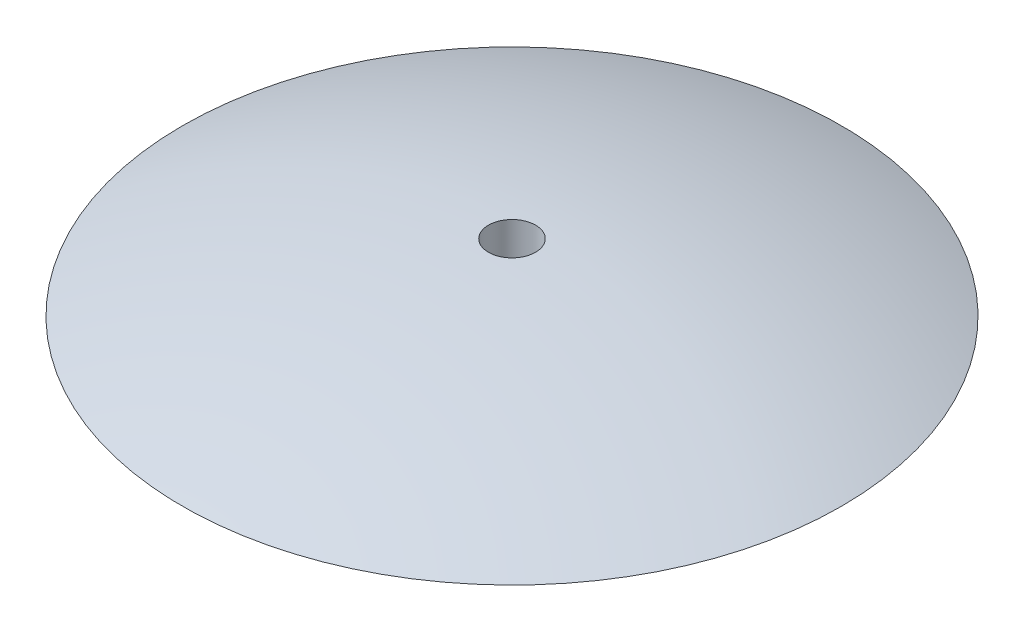
ISO-10303-21;
HEADER;
FILE_DESCRIPTION(('STEP AP214'),'2;1');
FILE_NAME('part.step','',(''),(''),'','','');
FILE_SCHEMA(('AUTOMOTIVE_DESIGN { 1 0 10303 214 1 1 1 1 }'));
ENDSEC;
DATA;
#1=APPLICATION_CONTEXT('core data for automotive mechanical design processes');
#2=APPLICATION_PROTOCOL_DEFINITION('international standard','automotive_design',2000,#1);
#3=PRODUCT_CONTEXT('',#1,'mechanical');
#4=PRODUCT('Part','Part','',(#3));
#5=PRODUCT_RELATED_PRODUCT_CATEGORY('part','',(#4));
#6=PRODUCT_DEFINITION_FORMATION('','',#4);
#7=PRODUCT_DEFINITION_CONTEXT('part definition',#1,'design');
#8=PRODUCT_DEFINITION('design','',#6,#7);
#9=PRODUCT_DEFINITION_SHAPE('','',#8);
#10=(LENGTH_UNIT() NAMED_UNIT(*) SI_UNIT(.MILLI.,.METRE.));
#11=(NAMED_UNIT(*) PLANE_ANGLE_UNIT() SI_UNIT($,.RADIAN.));
#12=(NAMED_UNIT(*) SI_UNIT($,.STERADIAN.) SOLID_ANGLE_UNIT());
#13=UNCERTAINTY_MEASURE_WITH_UNIT(LENGTH_MEASURE(1.E-05),#10,'distance_accuracy_value','');
#14=(GEOMETRIC_REPRESENTATION_CONTEXT(3) GLOBAL_UNCERTAINTY_ASSIGNED_CONTEXT((#13)) GLOBAL_UNIT_ASSIGNED_CONTEXT((#10,
#11,#12)) REPRESENTATION_CONTEXT('',''));
#15=CARTESIAN_POINT('',(0.,0.,0.));
#16=DIRECTION('',(0.,0.,1.));
#17=DIRECTION('',(1.,0.,0.));
#18=AXIS2_PLACEMENT_3D('',#15,#16,#17);
#19=CARTESIAN_POINT('',(0.,0.,0.));
#20=DIRECTION('',(0.,1.,0.));
#21=DIRECTION('',(1.,0.,0.));
#22=AXIS2_PLACEMENT_3D('',#19,#20,#21);
#23=SPHERICAL_SURFACE('',#22,125.);
#24=CARTESIAN_POINT('',(0.,124.950990392233,0.));
#25=DIRECTION('',(0.,-1.,0.));
#26=DIRECTION('',(0.,0.,-1.));
#27=AXIS2_PLACEMENT_3D('',#24,#25,#26);
#28=CIRCLE('',#27,3.5);
#29=CARTESIAN_POINT('',(3.49999999999989,124.950990392233,0.));
#30=VERTEX_POINT('',#29);
#31=EDGE_CURVE('E37',#30,#30,#28,.T.);
#32=CARTESIAN_POINT('',(0.,115.,0.));
#33=DIRECTION('',(0.,1.,0.));
#34=DIRECTION('',(0.,0.,1.));
#35=AXIS2_PLACEMENT_3D('',#32,#33,#34);
#36=CIRCLE('',#35,48.9897948556635);
#37=CARTESIAN_POINT('',(48.9897948556636,115.,0.));
#38=VERTEX_POINT('',#37);
#39=EDGE_CURVE('E10',#38,#38,#36,.T.);
#40=CARTESIAN_POINT('',(3.49999999999989,124.950990392233,0.));
#41=CARTESIAN_POINT('',(3.9877151951773,124.937329151167,0.));
#42=CARTESIAN_POINT('',(4.47535039404707,124.92081212117,0.));
#43=CARTESIAN_POINT('',(5.4503939607175,124.882069365421,0.));
#44=CARTESIAN_POINT('',(5.93780232851816,124.859843639667,0.));
#45=CARTESIAN_POINT('',(6.91232539459649,124.809686374509,0.));
#46=CARTESIAN_POINT('',(7.39944009287416,124.781754835103,0.));
#47=CARTESIAN_POINT('',(8.37330903005358,124.720189816847,0.));
#48=CARTESIAN_POINT('',(8.86006326895532,124.686556337997,0.));
#49=CARTESIAN_POINT('',(9.83314454472187,124.613592040689,0.));
#50=CARTESIAN_POINT('',(10.3194715815867,124.574261222232,0.));
#51=CARTESIAN_POINT('',(11.2916317697933,124.48990764181,0.));
#52=CARTESIAN_POINT('',(11.7774649211352,124.444884879845,0.));
#53=CARTESIAN_POINT('',(12.7485707223695,124.349153584933,0.));
#54=CARTESIAN_POINT('',(13.233843372262,124.298445051985,0.));
#55=CARTESIAN_POINT('',(14.2037616315684,124.191349168328,0.));
#56=CARTESIAN_POINT('',(14.6884072409824,124.134961817619,0.));
#57=CARTESIAN_POINT('',(15.6570049662687,124.01651603003,0.));
#58=CARTESIAN_POINT('',(16.140957082141,123.954457593151,0.));
#59=CARTESIAN_POINT('',(17.108101462374,123.824678142495,0.));
#60=CARTESIAN_POINT('',(17.5912937267346,123.756957128717,0.));
#61=CARTESIAN_POINT('',(18.5568521501613,123.61586180995,0.));
#62=CARTESIAN_POINT('',(19.0392183092274,123.54248750496,0.));
#63=CARTESIAN_POINT('',(20.0030583815557,123.390095664618,0.));
#64=CARTESIAN_POINT('',(20.4845322948178,123.311078129266,0.));
#65=CARTESIAN_POINT('',(21.4465218573705,123.147410662835,0.));
#66=CARTESIAN_POINT('',(21.927037506661,123.062760731754,0.));
#67=CARTESIAN_POINT('',(22.8870446544968,122.887840080793,0.));
#68=CARTESIAN_POINT('',(23.3665361530421,122.797569360912,0.));
#69=CARTESIAN_POINT('',(24.3244292530422,122.611419509984,0.));
#70=CARTESIAN_POINT('',(24.802830854497,122.515540378936,0.));
#71=CARTESIAN_POINT('',(25.758478563414,122.318186852314,0.));
#72=CARTESIAN_POINT('',(26.2357246708762,122.21671245674,0.));
#73=CARTESIAN_POINT('',(27.1889959533438,122.008182314911,0.));
#74=CARTESIAN_POINT('',(27.665021128349,121.901126568656,0.));
#75=CARTESIAN_POINT('',(28.6157852748485,121.681448404608,0.));
#76=CARTESIAN_POINT('',(29.0905242463428,121.568825986815,0.));
#77=CARTESIAN_POINT('',(30.0386508911263,121.338029922117,0.));
#78=CARTESIAN_POINT('',(30.5120385644156,121.219856275212,0.));
#79=CARTESIAN_POINT('',(31.457397703381,120.977973955885,0.));
#80=CARTESIAN_POINT('',(31.9293691690571,120.854265283463,0.));
#81=CARTESIAN_POINT('',(32.8718311775738,120.601329875639,0.));
#82=CARTESIAN_POINT('',(33.3423217204143,120.472103140237,0.));
#83=CARTESIAN_POINT('',(34.2817573710971,120.208149325613,0.));
#84=CARTESIAN_POINT('',(34.7507024789393,120.07342224639,0.));
#85=CARTESIAN_POINT('',(35.6869829593671,119.79848621747,0.));
#86=CARTESIAN_POINT('',(36.1543183319526,119.658277267772,0.));
#87=CARTESIAN_POINT('',(37.0873152623327,119.372396722911,0.));
#88=CARTESIAN_POINT('',(37.5529768201273,119.226725127747,0.));
#89=CARTESIAN_POINT('',(38.4825622708912,118.929939265963,0.));
#90=CARTESIAN_POINT('',(38.9464861638606,118.778824999342,0.));
#91=CARTESIAN_POINT('',(39.8725326732327,118.471174515006,0.));
#92=CARTESIAN_POINT('',(40.3346552896354,118.314638297291,0.));
#93=CARTESIAN_POINT('',(41.2570358810075,117.996165374303,0.));
#94=CARTESIAN_POINT('',(41.7172938559768,117.834228669029,0.));
#95=CARTESIAN_POINT('',(42.6358820557015,117.504976975958,0.));
#96=CARTESIAN_POINT('',(43.0942122804569,117.337661988159,0.));
#97=CARTESIAN_POINT('',(44.0088821337609,116.997676668791,0.));
#98=CARTESIAN_POINT('',(44.4652217623096,116.825006337222,0.));
#99=CARTESIAN_POINT('',(45.3758478558956,116.474334017304,0.));
#100=CARTESIAN_POINT('',(45.8301343209328,116.296332028957,0.));
#101=CARTESIAN_POINT('',(46.7365917802786,115.935020761538,0.));
#102=CARTESIAN_POINT('',(47.1887627745871,115.751711482468,0.));
#103=CARTESIAN_POINT('',(48.0909273553237,115.37981092144,0.));
#104=CARTESIAN_POINT('',(48.5409209417518,115.191219639483,0.));
#105=CARTESIAN_POINT('',(48.9897948556636,115.,0.));
#106=B_SPLINE_CURVE_WITH_KNOTS('',3,(#40,#41,#42,#43,#44,#45,#46,#47,#48,#49,#50,#51,#52,#53,
#54,#55,#56,#57,#58,#59,#60,#61,#62,#63,#64,#65,#66,#67,#68,#69,#70,#71,#72,#73,#74,#75,#76,#77,
#78,#79,#80,#81,#82,#83,#84,#85,#86,#87,#88,#89,#90,#91,#92,#93,#94,#95,#96,#97,#98,#99,#100,
#101,#102,#103,#104,#105),.UNSPECIFIED.,.F.,.F.,(4,2,2,2,2,2,2,2,2,2,2,2,2,2,2,2,2,2,2,2,2,2,2,
2,2,2,2,2,2,2,2,2,4),(0.,1.46371109685941,2.92742219371885,4.39113329057826,5.85484438743769,
7.3185554842971,8.78226658115654,10.245977678016,11.7096887748754,13.1733998717348,
14.6371109685942,16.1008220654536,17.5645331623131,19.0282442591725,20.4919553560319,
21.9556664528913,23.4193775497507,24.8830886466102,26.3467997434696,27.810510840329,
29.2742219371884,30.7379330340479,32.2016441309073,33.6653552277667,35.1290663246261,
36.5927774214856,38.056488518345,39.5201996152044,40.9839107120638,42.4476218089232,
43.9113329057827,45.3750440026421,46.8387550995015),.UNSPECIFIED.);
#107=EDGE_CURVE('BSEAM31',#30,#38,#106,.T.);
#108=ORIENTED_EDGE('',*,*,#31,.T.);
#109=ORIENTED_EDGE('',*,*,#39,.T.);
#110=ORIENTED_EDGE('',*,*,#107,.T.);
#111=ORIENTED_EDGE('',*,*,#107,.F.);
#112=EDGE_LOOP('',(#108,#110,#109,#111));
#113=FACE_BOUND('',#112,.T.);
#114=ADVANCED_FACE('F31',(#113),#23,.T.);
#115=CARTESIAN_POINT('',(48.9897948556635,115.,0.));
#116=DIRECTION('',(0.,1.,0.));
#117=DIRECTION('',(0.,0.,1.));
#118=AXIS2_PLACEMENT_3D('',#115,#116,#117);
#119=PLANE('',#118);
#120=CARTESIAN_POINT('',(0.,115.,0.));
#121=DIRECTION('',(0.,-1.,0.));
#122=DIRECTION('',(0.,0.,-1.));
#123=AXIS2_PLACEMENT_3D('',#120,#121,#122);
#124=CIRCLE('',#123,3.5);
#125=CARTESIAN_POINT('',(0.,115.,-3.5));
#126=VERTEX_POINT('',#125);
#127=EDGE_CURVE('E41',#126,#126,#124,.T.);
#128=ORIENTED_EDGE('',*,*,#127,.F.);
#129=EDGE_LOOP('',(#128));
#130=FACE_BOUND('',#129,.T.);
#131=ORIENTED_EDGE('',*,*,#39,.F.);
#132=EDGE_LOOP('',(#131));
#133=FACE_BOUND('',#132,.T.);
#134=ADVANCED_FACE('F51',(#130,#133),#119,.F.);
#135=CARTESIAN_POINT('',(0.,125.,0.));
#136=DIRECTION('',(0.,-1.,0.));
#137=DIRECTION('',(0.,0.,-1.));
#138=AXIS2_PLACEMENT_3D('',#135,#136,#137);
#139=CYLINDRICAL_SURFACE('',#138,3.5);
#140=ORIENTED_EDGE('',*,*,#127,.T.);
#141=EDGE_LOOP('',(#140));
#142=FACE_BOUND('',#141,.T.);
#143=ORIENTED_EDGE('',*,*,#31,.F.);
#144=EDGE_LOOP('',(#143));
#145=FACE_BOUND('',#144,.T.);
#146=ADVANCED_FACE('F48',(#142,#145),#139,.F.);
#147=CLOSED_SHELL('',(#114,#134,#146));
#148=MANIFOLD_SOLID_BREP('B2',#147);
#149=ADVANCED_BREP_SHAPE_REPRESENTATION('',(#18,#148),#14);
#150=SHAPE_DEFINITION_REPRESENTATION(#9,#149);
ENDSEC;
END-ISO-10303-21;
